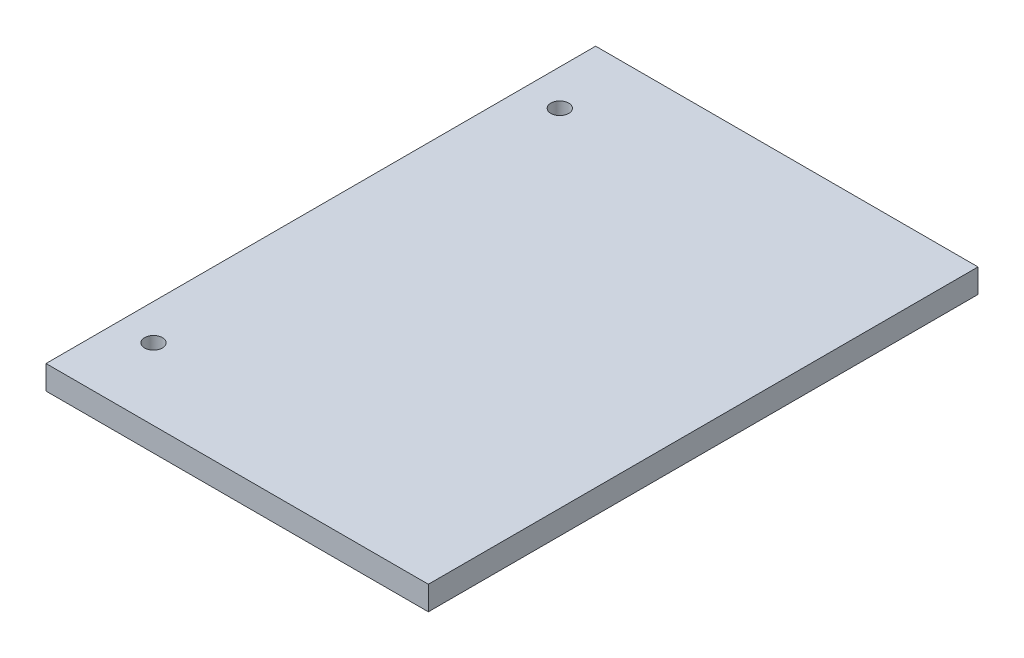
ISO-10303-21;
HEADER;
FILE_DESCRIPTION(('STEP AP214'),'2;1');
FILE_NAME('part.step','',(''),(''),'','','');
FILE_SCHEMA(('AUTOMOTIVE_DESIGN { 1 0 10303 214 1 1 1 1 }'));
ENDSEC;
DATA;
#1=APPLICATION_CONTEXT('core data for automotive mechanical design processes');
#2=APPLICATION_PROTOCOL_DEFINITION('international standard','automotive_design',2000,#1);
#3=PRODUCT_CONTEXT('',#1,'mechanical');
#4=PRODUCT('Part','Part','',(#3));
#5=PRODUCT_RELATED_PRODUCT_CATEGORY('part','',(#4));
#6=PRODUCT_DEFINITION_FORMATION('','',#4);
#7=PRODUCT_DEFINITION_CONTEXT('part definition',#1,'design');
#8=PRODUCT_DEFINITION('design','',#6,#7);
#9=PRODUCT_DEFINITION_SHAPE('','',#8);
#10=(LENGTH_UNIT() NAMED_UNIT(*) SI_UNIT(.MILLI.,.METRE.));
#11=(NAMED_UNIT(*) PLANE_ANGLE_UNIT() SI_UNIT($,.RADIAN.));
#12=(NAMED_UNIT(*) SI_UNIT($,.STERADIAN.) SOLID_ANGLE_UNIT());
#13=UNCERTAINTY_MEASURE_WITH_UNIT(LENGTH_MEASURE(1.E-05),#10,'distance_accuracy_value','');
#14=(GEOMETRIC_REPRESENTATION_CONTEXT(3) GLOBAL_UNCERTAINTY_ASSIGNED_CONTEXT((#13)) GLOBAL_UNIT_ASSIGNED_CONTEXT((#10,
#11,#12)) REPRESENTATION_CONTEXT('',''));
#15=CARTESIAN_POINT('',(0.,0.,0.));
#16=DIRECTION('',(0.,0.,1.));
#17=DIRECTION('',(1.,0.,0.));
#18=AXIS2_PLACEMENT_3D('',#15,#16,#17);
#19=CARTESIAN_POINT('',(0.,6.35,0.));
#20=DIRECTION('',(1.,0.,0.));
#21=DIRECTION('',(0.,0.,-1.));
#22=AXIS2_PLACEMENT_3D('',#19,#20,#21);
#23=PLANE('',#22);
#24=DIRECTION('',(0.,0.,1.));
#25=VECTOR('',#24,1.);
#26=CARTESIAN_POINT('',(0.,0.,0.));
#27=LINE('',#26,#25);
#28=CARTESIAN_POINT('',(0.,0.,0.));
#29=VERTEX_POINT('',#28);
#30=CARTESIAN_POINT('',(0.,0.,146.05));
#31=VERTEX_POINT('',#30);
#32=EDGE_CURVE('E105',#29,#31,#27,.T.);
#33=ORIENTED_EDGE('',*,*,#32,.T.);
#34=DIRECTION('',(0.,-1.,0.));
#35=VECTOR('',#34,1.);
#36=CARTESIAN_POINT('',(0.,6.35,146.05));
#37=LINE('',#36,#35);
#38=CARTESIAN_POINT('',(0.,6.35,146.05));
#39=VERTEX_POINT('',#38);
#40=EDGE_CURVE('E11',#39,#31,#37,.T.);
#41=ORIENTED_EDGE('',*,*,#40,.F.);
#42=DIRECTION('',(0.,0.,1.));
#43=VECTOR('',#42,1.);
#44=CARTESIAN_POINT('',(0.,6.35,0.));
#45=LINE('',#44,#43);
#46=CARTESIAN_POINT('',(0.,6.35,0.));
#47=VERTEX_POINT('',#46);
#48=EDGE_CURVE('E89',#47,#39,#45,.T.);
#49=ORIENTED_EDGE('',*,*,#48,.F.);
#50=DIRECTION('',(0.,-1.,0.));
#51=VECTOR('',#50,1.);
#52=CARTESIAN_POINT('',(0.,6.35,0.));
#53=LINE('',#52,#51);
#54=EDGE_CURVE('E97',#47,#29,#53,.T.);
#55=ORIENTED_EDGE('',*,*,#54,.T.);
#56=EDGE_LOOP('',(#33,#41,#49,#55));
#57=FACE_BOUND('',#56,.T.);
#58=ADVANCED_FACE('F39',(#57),#23,.F.);
#59=CARTESIAN_POINT('',(0.,6.35,146.05));
#60=DIRECTION('',(0.,0.,-1.));
#61=DIRECTION('',(-1.,0.,0.));
#62=AXIS2_PLACEMENT_3D('',#59,#60,#61);
#63=PLANE('',#62);
#64=DIRECTION('',(1.,0.,0.));
#65=VECTOR('',#64,1.);
#66=CARTESIAN_POINT('',(0.,0.,146.05));
#67=LINE('',#66,#65);
#68=CARTESIAN_POINT('',(101.6,0.,146.05));
#69=VERTEX_POINT('',#68);
#70=EDGE_CURVE('E92',#31,#69,#67,.T.);
#71=ORIENTED_EDGE('',*,*,#70,.T.);
#72=DIRECTION('',(0.,-1.,0.));
#73=VECTOR('',#72,1.);
#74=CARTESIAN_POINT('',(101.6,6.35,146.05));
#75=LINE('',#74,#73);
#76=CARTESIAN_POINT('',(101.6,6.35,146.05));
#77=VERTEX_POINT('',#76);
#78=EDGE_CURVE('E50',#77,#69,#75,.T.);
#79=ORIENTED_EDGE('',*,*,#78,.F.);
#80=DIRECTION('',(1.,0.,0.));
#81=VECTOR('',#80,1.);
#82=CARTESIAN_POINT('',(0.,6.35,146.05));
#83=LINE('',#82,#81);
#84=EDGE_CURVE('E82',#39,#77,#83,.T.);
#85=ORIENTED_EDGE('',*,*,#84,.F.);
#86=ORIENTED_EDGE('',*,*,#40,.T.);
#87=EDGE_LOOP('',(#71,#79,#85,#86));
#88=FACE_BOUND('',#87,.T.);
#89=ADVANCED_FACE('F93',(#88),#63,.F.);
#90=CARTESIAN_POINT('',(101.6,6.35,0.));
#91=DIRECTION('',(-1.,0.,0.));
#92=DIRECTION('',(0.,0.,1.));
#93=AXIS2_PLACEMENT_3D('',#90,#91,#92);
#94=PLANE('',#93);
#95=DIRECTION('',(0.,0.,-1.));
#96=VECTOR('',#95,1.);
#97=CARTESIAN_POINT('',(101.6,0.,0.));
#98=LINE('',#97,#96);
#99=CARTESIAN_POINT('',(101.6,0.,0.));
#100=VERTEX_POINT('',#99);
#101=EDGE_CURVE('E75',#69,#100,#98,.T.);
#102=ORIENTED_EDGE('',*,*,#101,.T.);
#103=DIRECTION('',(0.,-1.,0.));
#104=VECTOR('',#103,1.);
#105=CARTESIAN_POINT('',(101.6,6.35,0.));
#106=LINE('',#105,#104);
#107=CARTESIAN_POINT('',(101.6,6.35,0.));
#108=VERTEX_POINT('',#107);
#109=EDGE_CURVE('E94',#108,#100,#106,.T.);
#110=ORIENTED_EDGE('',*,*,#109,.F.);
#111=DIRECTION('',(0.,0.,-1.));
#112=VECTOR('',#111,1.);
#113=CARTESIAN_POINT('',(101.6,6.35,0.));
#114=LINE('',#113,#112);
#115=EDGE_CURVE('E88',#77,#108,#114,.T.);
#116=ORIENTED_EDGE('',*,*,#115,.F.);
#117=ORIENTED_EDGE('',*,*,#78,.T.);
#118=EDGE_LOOP('',(#102,#110,#116,#117));
#119=FACE_BOUND('',#118,.T.);
#120=ADVANCED_FACE('F96',(#119),#94,.F.);
#121=CARTESIAN_POINT('',(0.,6.35,0.));
#122=DIRECTION('',(0.,0.,1.));
#123=DIRECTION('',(1.,0.,0.));
#124=AXIS2_PLACEMENT_3D('',#121,#122,#123);
#125=PLANE('',#124);
#126=DIRECTION('',(-1.,0.,0.));
#127=VECTOR('',#126,1.);
#128=CARTESIAN_POINT('',(0.,0.,0.));
#129=LINE('',#128,#127);
#130=EDGE_CURVE('E76',#100,#29,#129,.T.);
#131=ORIENTED_EDGE('',*,*,#130,.T.);
#132=ORIENTED_EDGE('',*,*,#54,.F.);
#133=DIRECTION('',(-1.,0.,0.));
#134=VECTOR('',#133,1.);
#135=CARTESIAN_POINT('',(0.,6.35,0.));
#136=LINE('',#135,#134);
#137=EDGE_CURVE('E54',#108,#47,#136,.T.);
#138=ORIENTED_EDGE('',*,*,#137,.F.);
#139=ORIENTED_EDGE('',*,*,#109,.T.);
#140=EDGE_LOOP('',(#131,#132,#138,#139));
#141=FACE_BOUND('',#140,.T.);
#142=ADVANCED_FACE('F106',(#141),#125,.F.);
#143=CARTESIAN_POINT('',(0.,6.35,0.));
#144=DIRECTION('',(0.,1.,0.));
#145=DIRECTION('',(0.,0.,1.));
#146=AXIS2_PLACEMENT_3D('',#143,#144,#145);
#147=PLANE('',#146);
#148=CARTESIAN_POINT('',(9.525,6.35,19.05));
#149=DIRECTION('',(0.,1.,0.));
#150=DIRECTION('',(0.,0.,1.));
#151=AXIS2_PLACEMENT_3D('',#148,#149,#150);
#152=CIRCLE('',#151,2.38125);
#153=CARTESIAN_POINT('',(9.525,6.35,21.43125));
#154=VERTEX_POINT('',#153);
#155=EDGE_CURVE('E122',#154,#154,#152,.T.);
#156=ORIENTED_EDGE('',*,*,#155,.F.);
#157=EDGE_LOOP('',(#156));
#158=FACE_BOUND('',#157,.T.);
#159=CARTESIAN_POINT('',(9.525,6.35,127.));
#160=DIRECTION('',(0.,1.,0.));
#161=DIRECTION('',(0.,0.,1.));
#162=AXIS2_PLACEMENT_3D('',#159,#160,#161);
#163=CIRCLE('',#162,2.38125);
#164=CARTESIAN_POINT('',(9.525,6.35,129.38125));
#165=VERTEX_POINT('',#164);
#166=EDGE_CURVE('E119',#165,#165,#163,.T.);
#167=ORIENTED_EDGE('',*,*,#166,.F.);
#168=EDGE_LOOP('',(#167));
#169=FACE_BOUND('',#168,.T.);
#170=ORIENTED_EDGE('',*,*,#48,.T.);
#171=ORIENTED_EDGE('',*,*,#84,.T.);
#172=ORIENTED_EDGE('',*,*,#115,.T.);
#173=ORIENTED_EDGE('',*,*,#137,.T.);
#174=EDGE_LOOP('',(#170,#171,#172,#173));
#175=FACE_BOUND('',#174,.T.);
#176=ADVANCED_FACE('F86',(#158,#169,#175),#147,.T.);
#177=CARTESIAN_POINT('',(0.,0.,0.));
#178=DIRECTION('',(0.,1.,0.));
#179=DIRECTION('',(0.,0.,1.));
#180=AXIS2_PLACEMENT_3D('',#177,#178,#179);
#181=PLANE('',#180);
#182=CARTESIAN_POINT('',(9.525,0.,19.05));
#183=DIRECTION('',(0.,1.,0.));
#184=DIRECTION('',(0.,0.,1.));
#185=AXIS2_PLACEMENT_3D('',#182,#183,#184);
#186=CIRCLE('',#185,2.38125);
#187=CARTESIAN_POINT('',(9.525,0.,21.43125));
#188=VERTEX_POINT('',#187);
#189=EDGE_CURVE('E103',#188,#188,#186,.T.);
#190=ORIENTED_EDGE('',*,*,#189,.T.);
#191=EDGE_LOOP('',(#190));
#192=FACE_BOUND('',#191,.T.);
#193=CARTESIAN_POINT('',(9.525,0.,127.));
#194=DIRECTION('',(0.,1.,0.));
#195=DIRECTION('',(0.,0.,1.));
#196=AXIS2_PLACEMENT_3D('',#193,#194,#195);
#197=CIRCLE('',#196,2.38125);
#198=CARTESIAN_POINT('',(9.525,0.,129.38125));
#199=VERTEX_POINT('',#198);
#200=EDGE_CURVE('E117',#199,#199,#197,.T.);
#201=ORIENTED_EDGE('',*,*,#200,.T.);
#202=EDGE_LOOP('',(#201));
#203=FACE_BOUND('',#202,.T.);
#204=ORIENTED_EDGE('',*,*,#32,.F.);
#205=ORIENTED_EDGE('',*,*,#130,.F.);
#206=ORIENTED_EDGE('',*,*,#101,.F.);
#207=ORIENTED_EDGE('',*,*,#70,.F.);
#208=EDGE_LOOP('',(#204,#205,#206,#207));
#209=FACE_BOUND('',#208,.T.);
#210=ADVANCED_FACE('F111',(#192,#203,#209),#181,.F.);
#211=CARTESIAN_POINT('',(9.525,0.,127.));
#212=DIRECTION('',(0.,1.,0.));
#213=DIRECTION('',(0.,0.,1.));
#214=AXIS2_PLACEMENT_3D('',#211,#212,#213);
#215=CYLINDRICAL_SURFACE('',#214,2.38125);
#216=ORIENTED_EDGE('',*,*,#200,.F.);
#217=EDGE_LOOP('',(#216));
#218=FACE_BOUND('',#217,.T.);
#219=ORIENTED_EDGE('',*,*,#166,.T.);
#220=EDGE_LOOP('',(#219));
#221=FACE_BOUND('',#220,.T.);
#222=ADVANCED_FACE('F133',(#218,#221),#215,.F.);
#223=CARTESIAN_POINT('',(9.525,0.,19.05));
#224=DIRECTION('',(0.,1.,0.));
#225=DIRECTION('',(0.,0.,1.));
#226=AXIS2_PLACEMENT_3D('',#223,#224,#225);
#227=CYLINDRICAL_SURFACE('',#226,2.38125);
#228=ORIENTED_EDGE('',*,*,#189,.F.);
#229=EDGE_LOOP('',(#228));
#230=FACE_BOUND('',#229,.T.);
#231=ORIENTED_EDGE('',*,*,#155,.T.);
#232=EDGE_LOOP('',(#231));
#233=FACE_BOUND('',#232,.T.);
#234=ADVANCED_FACE('F127',(#230,#233),#227,.F.);
#235=CLOSED_SHELL('',(#58,#89,#120,#142,#176,#210,#222,#234));
#236=MANIFOLD_SOLID_BREP('B2',#235);
#237=ADVANCED_BREP_SHAPE_REPRESENTATION('',(#18,#236),#14);
#238=SHAPE_DEFINITION_REPRESENTATION(#9,#237);
ENDSEC;
END-ISO-10303-21;
